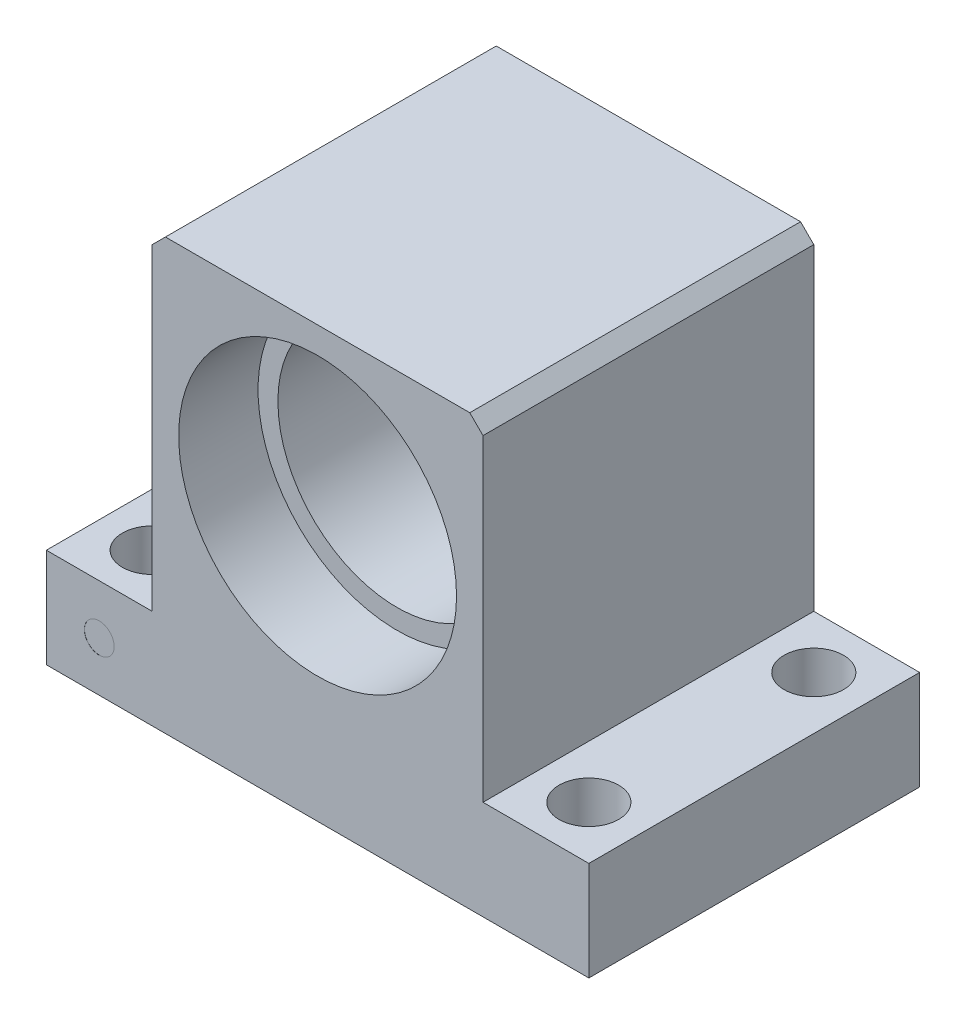
ISO-10303-21;
HEADER;
FILE_DESCRIPTION(('STEP AP214'),'2;1');
FILE_NAME('part.step','',(''),(''),'','','');
FILE_SCHEMA(('AUTOMOTIVE_DESIGN { 1 0 10303 214 1 1 1 1 }'));
ENDSEC;
DATA;
#1=APPLICATION_CONTEXT('core data for automotive mechanical design processes');
#2=APPLICATION_PROTOCOL_DEFINITION('international standard','automotive_design',2000,#1);
#3=PRODUCT_CONTEXT('',#1,'mechanical');
#4=PRODUCT('Part','Part','',(#3));
#5=PRODUCT_RELATED_PRODUCT_CATEGORY('part','',(#4));
#6=PRODUCT_DEFINITION_FORMATION('','',#4);
#7=PRODUCT_DEFINITION_CONTEXT('part definition',#1,'design');
#8=PRODUCT_DEFINITION('design','',#6,#7);
#9=PRODUCT_DEFINITION_SHAPE('','',#8);
#10=(LENGTH_UNIT() NAMED_UNIT(*) SI_UNIT(.MILLI.,.METRE.));
#11=(NAMED_UNIT(*) PLANE_ANGLE_UNIT() SI_UNIT($,.RADIAN.));
#12=(NAMED_UNIT(*) SI_UNIT($,.STERADIAN.) SOLID_ANGLE_UNIT());
#13=UNCERTAINTY_MEASURE_WITH_UNIT(LENGTH_MEASURE(1.E-05),#10,'distance_accuracy_value','');
#14=(GEOMETRIC_REPRESENTATION_CONTEXT(3) GLOBAL_UNCERTAINTY_ASSIGNED_CONTEXT((#13)) GLOBAL_UNIT_ASSIGNED_CONTEXT((#10,
#11,#12)) REPRESENTATION_CONTEXT('',''));
#15=CARTESIAN_POINT('',(0.,0.,0.));
#16=DIRECTION('',(0.,0.,1.));
#17=DIRECTION('',(1.,0.,0.));
#18=AXIS2_PLACEMENT_3D('',#15,#16,#17);
#19=CARTESIAN_POINT('',(0.,0.,-25.));
#20=DIRECTION('',(0.,0.,1.));
#21=DIRECTION('',(1.,0.,0.));
#22=AXIS2_PLACEMENT_3D('',#19,#20,#21);
#23=CYLINDRICAL_SURFACE('',#22,18.);
#24=CARTESIAN_POINT('',(0.,0.,13.));
#25=DIRECTION('',(0.,0.,1.));
#26=DIRECTION('',(1.,0.,0.));
#27=AXIS2_PLACEMENT_3D('',#24,#25,#26);
#28=CIRCLE('',#27,18.);
#29=CARTESIAN_POINT('',(18.,0.,13.));
#30=VERTEX_POINT('',#29);
#31=EDGE_CURVE('E20',#30,#30,#28,.F.);
#32=ORIENTED_EDGE('',*,*,#31,.F.);
#33=EDGE_LOOP('',(#32));
#34=FACE_BOUND('',#33,.T.);
#35=CARTESIAN_POINT('',(0.,0.,-13.));
#36=DIRECTION('',(0.,0.,1.));
#37=DIRECTION('',(1.,0.,0.));
#38=AXIS2_PLACEMENT_3D('',#35,#36,#37);
#39=CIRCLE('',#38,18.);
#40=CARTESIAN_POINT('',(18.,0.,-13.));
#41=VERTEX_POINT('',#40);
#42=EDGE_CURVE('E178',#41,#41,#39,.T.);
#43=ORIENTED_EDGE('',*,*,#42,.F.);
#44=EDGE_LOOP('',(#43));
#45=FACE_BOUND('',#44,.T.);
#46=ADVANCED_FACE('F17',(#34,#45),#23,.F.);
#47=CARTESIAN_POINT('',(-33.,-32.5,24.98));
#48=DIRECTION('',(0.,0.,1.));
#49=DIRECTION('',(1.,0.,0.));
#50=AXIS2_PLACEMENT_3D('',#47,#48,#49);
#51=PLANE('',#50);
#52=CARTESIAN_POINT('',(-33.,-32.5,24.98));
#53=DIRECTION('',(0.,0.,-1.));
#54=DIRECTION('',(-1.,0.,0.));
#55=AXIS2_PLACEMENT_3D('',#52,#53,#54);
#56=CIRCLE('',#55,2.25);
#57=CARTESIAN_POINT('',(-35.25,-32.5,24.98));
#58=VERTEX_POINT('',#57);
#59=EDGE_CURVE('E176',#58,#58,#56,.F.);
#60=ORIENTED_EDGE('',*,*,#59,.T.);
#61=EDGE_LOOP('',(#60));
#62=FACE_BOUND('',#61,.T.);
#63=ADVANCED_FACE('F190',(#62),#51,.T.);
#64=CARTESIAN_POINT('',(0.,21.,13.));
#65=DIRECTION('',(0.,0.,1.));
#66=DIRECTION('',(1.,0.,0.));
#67=AXIS2_PLACEMENT_3D('',#64,#65,#66);
#68=PLANE('',#67);
#69=ORIENTED_EDGE('',*,*,#31,.T.);
#70=EDGE_LOOP('',(#69));
#71=FACE_BOUND('',#70,.T.);
#72=CARTESIAN_POINT('',(0.,0.,13.));
#73=DIRECTION('',(0.,0.,1.));
#74=DIRECTION('',(1.,0.,0.));
#75=AXIS2_PLACEMENT_3D('',#72,#73,#74);
#76=CIRCLE('',#75,21.);
#77=CARTESIAN_POINT('',(21.,0.,13.));
#78=VERTEX_POINT('',#77);
#79=EDGE_CURVE('E137',#78,#78,#76,.T.);
#80=ORIENTED_EDGE('',*,*,#79,.T.);
#81=EDGE_LOOP('',(#80));
#82=FACE_BOUND('',#81,.T.);
#83=ADVANCED_FACE('F185',(#71,#82),#68,.T.);
#84=CARTESIAN_POINT('',(0.,18.,-13.));
#85=DIRECTION('',(0.,0.,-1.));
#86=DIRECTION('',(-1.,0.,0.));
#87=AXIS2_PLACEMENT_3D('',#84,#85,#86);
#88=PLANE('',#87);
#89=ORIENTED_EDGE('',*,*,#42,.T.);
#90=EDGE_LOOP('',(#89));
#91=FACE_BOUND('',#90,.T.);
#92=CARTESIAN_POINT('',(0.,0.,-13.));
#93=DIRECTION('',(0.,0.,1.));
#94=DIRECTION('',(1.,0.,0.));
#95=AXIS2_PLACEMENT_3D('',#92,#93,#94);
#96=CIRCLE('',#95,21.);
#97=CARTESIAN_POINT('',(21.,0.,-13.));
#98=VERTEX_POINT('',#97);
#99=EDGE_CURVE('E116',#98,#98,#96,.F.);
#100=ORIENTED_EDGE('',*,*,#99,.T.);
#101=EDGE_LOOP('',(#100));
#102=FACE_BOUND('',#101,.T.);
#103=ADVANCED_FACE('F270',(#91,#102),#88,.T.);
#104=CARTESIAN_POINT('',(-33.,-32.5,24.98));
#105=DIRECTION('',(0.,0.,-1.));
#106=DIRECTION('',(-1.,0.,0.));
#107=AXIS2_PLACEMENT_3D('',#104,#105,#106);
#108=CYLINDRICAL_SURFACE('',#107,2.25);
#109=ORIENTED_EDGE('',*,*,#59,.F.);
#110=EDGE_LOOP('',(#109));
#111=FACE_BOUND('',#110,.T.);
#112=CARTESIAN_POINT('',(-33.,-32.5,25.));
#113=DIRECTION('',(0.,0.,-1.));
#114=DIRECTION('',(-1.,0.,0.));
#115=AXIS2_PLACEMENT_3D('',#112,#113,#114);
#116=CIRCLE('',#115,2.25);
#117=CARTESIAN_POINT('',(-35.25,-32.5,25.));
#118=VERTEX_POINT('',#117);
#119=EDGE_CURVE('E169',#118,#118,#116,.T.);
#120=ORIENTED_EDGE('',*,*,#119,.F.);
#121=EDGE_LOOP('',(#120));
#122=FACE_BOUND('',#121,.T.);
#123=ADVANCED_FACE('F266',(#111,#122),#108,.F.);
#124=CARTESIAN_POINT('',(0.,0.,-25.));
#125=DIRECTION('',(0.,0.,1.));
#126=DIRECTION('',(1.,0.,0.));
#127=AXIS2_PLACEMENT_3D('',#124,#125,#126);
#128=CYLINDRICAL_SURFACE('',#127,21.);
#129=CARTESIAN_POINT('',(0.,0.,25.));
#130=DIRECTION('',(0.,0.,1.));
#131=DIRECTION('',(1.,0.,0.));
#132=AXIS2_PLACEMENT_3D('',#129,#130,#131);
#133=CIRCLE('',#132,21.);
#134=CARTESIAN_POINT('',(21.,0.,25.));
#135=VERTEX_POINT('',#134);
#136=EDGE_CURVE('E165',#135,#135,#133,.F.);
#137=ORIENTED_EDGE('',*,*,#136,.F.);
#138=EDGE_LOOP('',(#137));
#139=FACE_BOUND('',#138,.T.);
#140=ORIENTED_EDGE('',*,*,#79,.F.);
#141=EDGE_LOOP('',(#140));
#142=FACE_BOUND('',#141,.T.);
#143=ADVANCED_FACE('F262',(#139,#142),#128,.F.);
#144=CARTESIAN_POINT('',(-25.,25.,25.));
#145=DIRECTION('',(1.,0.,0.));
#146=DIRECTION('',(0.,0.,-1.));
#147=AXIS2_PLACEMENT_3D('',#144,#145,#146);
#148=PLANE('',#147);
#149=DIRECTION('',(0.,0.,-1.));
#150=VECTOR('',#149,1.);
#151=CARTESIAN_POINT('',(-25.,-25.,25.));
#152=LINE('',#151,#150);
#153=CARTESIAN_POINT('',(-25.,-25.,-25.));
#154=VERTEX_POINT('',#153);
#155=CARTESIAN_POINT('',(-25.,-25.,25.));
#156=VERTEX_POINT('',#155);
#157=EDGE_CURVE('E131',#154,#156,#152,.F.);
#158=ORIENTED_EDGE('',*,*,#157,.T.);
#159=DIRECTION('',(0.,1.,0.));
#160=VECTOR('',#159,1.);
#161=CARTESIAN_POINT('',(-25.,0.,25.));
#162=LINE('',#161,#160);
#163=CARTESIAN_POINT('',(-25.,23.,25.));
#164=VERTEX_POINT('',#163);
#165=EDGE_CURVE('E121',#164,#156,#162,.F.);
#166=ORIENTED_EDGE('',*,*,#165,.F.);
#167=DIRECTION('',(0.,0.,1.));
#168=VECTOR('',#167,1.);
#169=CARTESIAN_POINT('',(-25.,23.,25.));
#170=LINE('',#169,#168);
#171=CARTESIAN_POINT('',(-25.,23.,-25.));
#172=VERTEX_POINT('',#171);
#173=EDGE_CURVE('E117',#172,#164,#170,.T.);
#174=ORIENTED_EDGE('',*,*,#173,.F.);
#175=DIRECTION('',(0.,1.,0.));
#176=VECTOR('',#175,1.);
#177=CARTESIAN_POINT('',(-25.,0.,-25.));
#178=LINE('',#177,#176);
#179=EDGE_CURVE('E428',#172,#154,#178,.F.);
#180=ORIENTED_EDGE('',*,*,#179,.T.);
#181=EDGE_LOOP('',(#158,#166,#174,#180));
#182=FACE_BOUND('',#181,.T.);
#183=ADVANCED_FACE('F258',(#182),#148,.F.);
#184=CARTESIAN_POINT('',(25.,-25.,25.));
#185=DIRECTION('',(-1.,0.,0.));
#186=DIRECTION('',(0.,0.,1.));
#187=AXIS2_PLACEMENT_3D('',#184,#185,#186);
#188=PLANE('',#187);
#189=DIRECTION('',(0.,0.,1.));
#190=VECTOR('',#189,1.);
#191=CARTESIAN_POINT('',(25.,23.,25.));
#192=LINE('',#191,#190);
#193=CARTESIAN_POINT('',(25.,23.,25.));
#194=VERTEX_POINT('',#193);
#195=CARTESIAN_POINT('',(25.,23.,-25.));
#196=VERTEX_POINT('',#195);
#197=EDGE_CURVE('E136',#194,#196,#192,.F.);
#198=ORIENTED_EDGE('',*,*,#197,.F.);
#199=DIRECTION('',(0.,1.,0.));
#200=VECTOR('',#199,1.);
#201=CARTESIAN_POINT('',(25.,0.,25.));
#202=LINE('',#201,#200);
#203=CARTESIAN_POINT('',(25.,-25.,25.));
#204=VERTEX_POINT('',#203);
#205=EDGE_CURVE('E439',#204,#194,#202,.T.);
#206=ORIENTED_EDGE('',*,*,#205,.F.);
#207=DIRECTION('',(0.,0.,-1.));
#208=VECTOR('',#207,1.);
#209=CARTESIAN_POINT('',(25.,-25.,25.));
#210=LINE('',#209,#208);
#211=CARTESIAN_POINT('',(25.,-25.,-25.));
#212=VERTEX_POINT('',#211);
#213=EDGE_CURVE('E129',#204,#212,#210,.T.);
#214=ORIENTED_EDGE('',*,*,#213,.T.);
#215=DIRECTION('',(0.,1.,0.));
#216=VECTOR('',#215,1.);
#217=CARTESIAN_POINT('',(25.,0.,-25.));
#218=LINE('',#217,#216);
#219=EDGE_CURVE('E456',#212,#196,#218,.T.);
#220=ORIENTED_EDGE('',*,*,#219,.T.);
#221=EDGE_LOOP('',(#198,#206,#214,#220));
#222=FACE_BOUND('',#221,.T.);
#223=ADVANCED_FACE('F255',(#222),#188,.F.);
#224=CARTESIAN_POINT('',(23.,25.,25.));
#225=DIRECTION('',(0.707106781186548,0.707106781186548,0.));
#226=DIRECTION('',(-0.707106781186548,0.707106781186548,0.));
#227=AXIS2_PLACEMENT_3D('',#224,#225,#226);
#228=PLANE('',#227);
#229=DIRECTION('',(-0.707106781186547,0.707106781186547,0.));
#230=VECTOR('',#229,1.);
#231=CARTESIAN_POINT('',(25.,23.,25.));
#232=LINE('',#231,#230);
#233=CARTESIAN_POINT('',(23.,25.,25.));
#234=VERTEX_POINT('',#233);
#235=EDGE_CURVE('E104',#194,#234,#232,.T.);
#236=ORIENTED_EDGE('',*,*,#235,.F.);
#237=ORIENTED_EDGE('',*,*,#197,.T.);
#238=DIRECTION('',(-0.707106781186547,0.707106781186547,0.));
#239=VECTOR('',#238,1.);
#240=CARTESIAN_POINT('',(25.,23.,-25.));
#241=LINE('',#240,#239);
#242=CARTESIAN_POINT('',(23.,25.,-25.));
#243=VERTEX_POINT('',#242);
#244=EDGE_CURVE('E459',#196,#243,#241,.T.);
#245=ORIENTED_EDGE('',*,*,#244,.T.);
#246=DIRECTION('',(0.,0.,-1.));
#247=VECTOR('',#246,1.);
#248=CARTESIAN_POINT('',(23.,25.,25.));
#249=LINE('',#248,#247);
#250=EDGE_CURVE('E92',#243,#234,#249,.F.);
#251=ORIENTED_EDGE('',*,*,#250,.T.);
#252=EDGE_LOOP('',(#236,#237,#245,#251));
#253=FACE_BOUND('',#252,.T.);
#254=ADVANCED_FACE('F252',(#253),#228,.T.);
#255=CARTESIAN_POINT('',(25.,25.,25.));
#256=DIRECTION('',(0.,-1.,0.));
#257=DIRECTION('',(0.,0.,-1.));
#258=AXIS2_PLACEMENT_3D('',#255,#256,#257);
#259=PLANE('',#258);
#260=DIRECTION('',(1.,0.,0.));
#261=VECTOR('',#260,1.);
#262=CARTESIAN_POINT('',(0.,25.,25.));
#263=LINE('',#262,#261);
#264=CARTESIAN_POINT('',(-23.,25.,25.));
#265=VERTEX_POINT('',#264);
#266=EDGE_CURVE('E98',#234,#265,#263,.F.);
#267=ORIENTED_EDGE('',*,*,#266,.F.);
#268=ORIENTED_EDGE('',*,*,#250,.F.);
#269=DIRECTION('',(1.,0.,0.));
#270=VECTOR('',#269,1.);
#271=CARTESIAN_POINT('',(0.,25.,-25.));
#272=LINE('',#271,#270);
#273=CARTESIAN_POINT('',(-23.,25.,-25.));
#274=VERTEX_POINT('',#273);
#275=EDGE_CURVE('E112',#243,#274,#272,.F.);
#276=ORIENTED_EDGE('',*,*,#275,.T.);
#277=DIRECTION('',(0.,0.,1.));
#278=VECTOR('',#277,1.);
#279=CARTESIAN_POINT('',(-23.,25.,25.));
#280=LINE('',#279,#278);
#281=EDGE_CURVE('E109',#265,#274,#280,.F.);
#282=ORIENTED_EDGE('',*,*,#281,.F.);
#283=EDGE_LOOP('',(#267,#268,#276,#282));
#284=FACE_BOUND('',#283,.T.);
#285=ADVANCED_FACE('F110',(#284),#259,.F.);
#286=CARTESIAN_POINT('',(-25.,23.,25.));
#287=DIRECTION('',(-0.707106781186548,0.707106781186548,0.));
#288=DIRECTION('',(-0.707106781186548,-0.707106781186548,0.));
#289=AXIS2_PLACEMENT_3D('',#286,#287,#288);
#290=PLANE('',#289);
#291=DIRECTION('',(-0.707106781186547,-0.707106781186547,0.));
#292=VECTOR('',#291,1.);
#293=CARTESIAN_POINT('',(-23.,25.,25.));
#294=LINE('',#293,#292);
#295=EDGE_CURVE('E102',#265,#164,#294,.T.);
#296=ORIENTED_EDGE('',*,*,#295,.F.);
#297=ORIENTED_EDGE('',*,*,#281,.T.);
#298=DIRECTION('',(-0.707106781186547,-0.707106781186547,0.));
#299=VECTOR('',#298,1.);
#300=CARTESIAN_POINT('',(-23.,25.,-25.));
#301=LINE('',#300,#299);
#302=EDGE_CURVE('E164',#274,#172,#301,.T.);
#303=ORIENTED_EDGE('',*,*,#302,.T.);
#304=ORIENTED_EDGE('',*,*,#173,.T.);
#305=EDGE_LOOP('',(#296,#297,#303,#304));
#306=FACE_BOUND('',#305,.T.);
#307=ADVANCED_FACE('F119',(#306),#290,.T.);
#308=CARTESIAN_POINT('',(0.,0.,-25.));
#309=DIRECTION('',(0.,0.,1.));
#310=DIRECTION('',(1.,0.,0.));
#311=AXIS2_PLACEMENT_3D('',#308,#309,#310);
#312=CYLINDRICAL_SURFACE('',#311,21.);
#313=CARTESIAN_POINT('',(0.,0.,-25.));
#314=DIRECTION('',(0.,0.,1.));
#315=DIRECTION('',(1.,0.,0.));
#316=AXIS2_PLACEMENT_3D('',#313,#314,#315);
#317=CIRCLE('',#316,21.);
#318=CARTESIAN_POINT('',(21.,0.,-25.));
#319=VERTEX_POINT('',#318);
#320=EDGE_CURVE('E161',#319,#319,#317,.F.);
#321=ORIENTED_EDGE('',*,*,#320,.T.);
#322=EDGE_LOOP('',(#321));
#323=FACE_BOUND('',#322,.T.);
#324=ORIENTED_EDGE('',*,*,#99,.F.);
#325=EDGE_LOOP('',(#324));
#326=FACE_BOUND('',#325,.T.);
#327=ADVANCED_FACE('F243',(#323,#326),#312,.F.);
#328=CARTESIAN_POINT('',(-25.,-25.,25.));
#329=DIRECTION('',(0.,-1.,0.));
#330=DIRECTION('',(0.,0.,-1.));
#331=AXIS2_PLACEMENT_3D('',#328,#329,#330);
#332=PLANE('',#331);
#333=CARTESIAN_POINT('',(-33.,-25.,17.));
#334=DIRECTION('',(0.,1.,0.));
#335=DIRECTION('',(0.,0.,1.));
#336=AXIS2_PLACEMENT_3D('',#333,#334,#335);
#337=CIRCLE('',#336,4.5);
#338=CARTESIAN_POINT('',(-33.,-25.,21.5));
#339=VERTEX_POINT('',#338);
#340=EDGE_CURVE('E152',#339,#339,#337,.F.);
#341=ORIENTED_EDGE('',*,*,#340,.T.);
#342=EDGE_LOOP('',(#341));
#343=FACE_BOUND('',#342,.T.);
#344=CARTESIAN_POINT('',(-33.,-25.,-17.));
#345=DIRECTION('',(0.,1.,0.));
#346=DIRECTION('',(0.,0.,1.));
#347=AXIS2_PLACEMENT_3D('',#344,#345,#346);
#348=CIRCLE('',#347,4.5);
#349=CARTESIAN_POINT('',(-33.,-25.,-12.5));
#350=VERTEX_POINT('',#349);
#351=EDGE_CURVE('E155',#350,#350,#348,.F.);
#352=ORIENTED_EDGE('',*,*,#351,.T.);
#353=EDGE_LOOP('',(#352));
#354=FACE_BOUND('',#353,.T.);
#355=DIRECTION('',(0.,0.,-1.));
#356=VECTOR('',#355,1.);
#357=CARTESIAN_POINT('',(-41.,-25.,25.));
#358=LINE('',#357,#356);
#359=CARTESIAN_POINT('',(-41.,-25.,-25.));
#360=VERTEX_POINT('',#359);
#361=CARTESIAN_POINT('',(-41.,-25.,25.));
#362=VERTEX_POINT('',#361);
#363=EDGE_CURVE('E106',#360,#362,#358,.F.);
#364=ORIENTED_EDGE('',*,*,#363,.T.);
#365=DIRECTION('',(1.,0.,0.));
#366=VECTOR('',#365,1.);
#367=CARTESIAN_POINT('',(0.,-25.,25.));
#368=LINE('',#367,#366);
#369=EDGE_CURVE('E123',#156,#362,#368,.F.);
#370=ORIENTED_EDGE('',*,*,#369,.F.);
#371=ORIENTED_EDGE('',*,*,#157,.F.);
#372=DIRECTION('',(1.,0.,0.));
#373=VECTOR('',#372,1.);
#374=CARTESIAN_POINT('',(0.,-25.,-25.));
#375=LINE('',#374,#373);
#376=EDGE_CURVE('E447',#154,#360,#375,.F.);
#377=ORIENTED_EDGE('',*,*,#376,.T.);
#378=EDGE_LOOP('',(#364,#370,#371,#377));
#379=FACE_BOUND('',#378,.T.);
#380=ADVANCED_FACE('F239',(#343,#354,#379),#332,.F.);
#381=CARTESIAN_POINT('',(41.,-25.,25.));
#382=DIRECTION('',(0.,-1.,0.));
#383=DIRECTION('',(0.,0.,-1.));
#384=AXIS2_PLACEMENT_3D('',#381,#382,#383);
#385=PLANE('',#384);
#386=CARTESIAN_POINT('',(33.,-25.,17.));
#387=DIRECTION('',(0.,1.,0.));
#388=DIRECTION('',(0.,0.,1.));
#389=AXIS2_PLACEMENT_3D('',#386,#387,#388);
#390=CIRCLE('',#389,4.5);
#391=CARTESIAN_POINT('',(33.,-25.,21.5));
#392=VERTEX_POINT('',#391);
#393=EDGE_CURVE('E148',#392,#392,#390,.F.);
#394=ORIENTED_EDGE('',*,*,#393,.T.);
#395=EDGE_LOOP('',(#394));
#396=FACE_BOUND('',#395,.T.);
#397=CARTESIAN_POINT('',(33.,-25.,-17.));
#398=DIRECTION('',(0.,1.,0.));
#399=DIRECTION('',(0.,0.,1.));
#400=AXIS2_PLACEMENT_3D('',#397,#398,#399);
#401=CIRCLE('',#400,4.5);
#402=CARTESIAN_POINT('',(33.,-25.,-12.5));
#403=VERTEX_POINT('',#402);
#404=EDGE_CURVE('E158',#403,#403,#401,.F.);
#405=ORIENTED_EDGE('',*,*,#404,.T.);
#406=EDGE_LOOP('',(#405));
#407=FACE_BOUND('',#406,.T.);
#408=ORIENTED_EDGE('',*,*,#213,.F.);
#409=DIRECTION('',(1.,0.,0.));
#410=VECTOR('',#409,1.);
#411=CARTESIAN_POINT('',(0.,-25.,25.));
#412=LINE('',#411,#410);
#413=CARTESIAN_POINT('',(41.,-25.,25.));
#414=VERTEX_POINT('',#413);
#415=EDGE_CURVE('E434',#414,#204,#412,.F.);
#416=ORIENTED_EDGE('',*,*,#415,.F.);
#417=DIRECTION('',(0.,0.,1.));
#418=VECTOR('',#417,1.);
#419=CARTESIAN_POINT('',(41.,-25.,25.));
#420=LINE('',#419,#418);
#421=CARTESIAN_POINT('',(41.,-25.,-25.));
#422=VERTEX_POINT('',#421);
#423=EDGE_CURVE('E444',#414,#422,#420,.F.);
#424=ORIENTED_EDGE('',*,*,#423,.T.);
#425=DIRECTION('',(1.,0.,0.));
#426=VECTOR('',#425,1.);
#427=CARTESIAN_POINT('',(0.,-25.,-25.));
#428=LINE('',#427,#426);
#429=EDGE_CURVE('E453',#422,#212,#428,.F.);
#430=ORIENTED_EDGE('',*,*,#429,.T.);
#431=EDGE_LOOP('',(#408,#416,#424,#430));
#432=FACE_BOUND('',#431,.T.);
#433=ADVANCED_FACE('F235',(#396,#407,#432),#385,.F.);
#434=CARTESIAN_POINT('',(-41.,-25.,25.));
#435=DIRECTION('',(1.,0.,0.));
#436=DIRECTION('',(0.,0.,-1.));
#437=AXIS2_PLACEMENT_3D('',#434,#435,#436);
#438=PLANE('',#437);
#439=DIRECTION('',(0.,0.,1.));
#440=VECTOR('',#439,1.);
#441=CARTESIAN_POINT('',(-41.,-40.,25.));
#442=LINE('',#441,#440);
#443=CARTESIAN_POINT('',(-41.,-40.,-25.));
#444=VERTEX_POINT('',#443);
#445=CARTESIAN_POINT('',(-41.,-40.,25.));
#446=VERTEX_POINT('',#445);
#447=EDGE_CURVE('E151',#444,#446,#442,.T.);
#448=ORIENTED_EDGE('',*,*,#447,.T.);
#449=DIRECTION('',(0.,1.,0.));
#450=VECTOR('',#449,1.);
#451=CARTESIAN_POINT('',(-41.,0.,25.));
#452=LINE('',#451,#450);
#453=EDGE_CURVE('E433',#362,#446,#452,.F.);
#454=ORIENTED_EDGE('',*,*,#453,.F.);
#455=ORIENTED_EDGE('',*,*,#363,.F.);
#456=DIRECTION('',(0.,1.,0.));
#457=VECTOR('',#456,1.);
#458=CARTESIAN_POINT('',(-41.,0.,-25.));
#459=LINE('',#458,#457);
#460=EDGE_CURVE('E449',#360,#444,#459,.F.);
#461=ORIENTED_EDGE('',*,*,#460,.T.);
#462=EDGE_LOOP('',(#448,#454,#455,#461));
#463=FACE_BOUND('',#462,.T.);
#464=ADVANCED_FACE('F231',(#463),#438,.F.);
#465=CARTESIAN_POINT('',(0.,0.,25.));
#466=DIRECTION('',(0.,0.,1.));
#467=DIRECTION('',(1.,0.,0.));
#468=AXIS2_PLACEMENT_3D('',#465,#466,#467);
#469=PLANE('',#468);
#470=ORIENTED_EDGE('',*,*,#136,.T.);
#471=EDGE_LOOP('',(#470));
#472=FACE_BOUND('',#471,.T.);
#473=ORIENTED_EDGE('',*,*,#119,.T.);
#474=EDGE_LOOP('',(#473));
#475=FACE_BOUND('',#474,.T.);
#476=ORIENTED_EDGE('',*,*,#205,.T.);
#477=ORIENTED_EDGE('',*,*,#235,.T.);
#478=ORIENTED_EDGE('',*,*,#266,.T.);
#479=ORIENTED_EDGE('',*,*,#295,.T.);
#480=ORIENTED_EDGE('',*,*,#165,.T.);
#481=ORIENTED_EDGE('',*,*,#369,.T.);
#482=ORIENTED_EDGE('',*,*,#453,.T.);
#483=DIRECTION('',(1.,0.,0.));
#484=VECTOR('',#483,1.);
#485=CARTESIAN_POINT('',(-41.,-40.,25.));
#486=LINE('',#485,#484);
#487=CARTESIAN_POINT('',(41.,-40.,25.));
#488=VERTEX_POINT('',#487);
#489=EDGE_CURVE('E465',#446,#488,#486,.T.);
#490=ORIENTED_EDGE('',*,*,#489,.T.);
#491=DIRECTION('',(0.,1.,0.));
#492=VECTOR('',#491,1.);
#493=CARTESIAN_POINT('',(41.,-40.,25.));
#494=LINE('',#493,#492);
#495=EDGE_CURVE('E168',#488,#414,#494,.T.);
#496=ORIENTED_EDGE('',*,*,#495,.T.);
#497=ORIENTED_EDGE('',*,*,#415,.T.);
#498=EDGE_LOOP('',(#476,#477,#478,#479,#480,#481,#482,#490,#496,#497));
#499=FACE_BOUND('',#498,.T.);
#500=ADVANCED_FACE('F100',(#472,#475,#499),#469,.T.);
#501=CARTESIAN_POINT('',(41.,-40.,25.));
#502=DIRECTION('',(-1.,0.,0.));
#503=DIRECTION('',(0.,0.,1.));
#504=AXIS2_PLACEMENT_3D('',#501,#502,#503);
#505=PLANE('',#504);
#506=ORIENTED_EDGE('',*,*,#423,.F.);
#507=ORIENTED_EDGE('',*,*,#495,.F.);
#508=DIRECTION('',(0.,0.,1.));
#509=VECTOR('',#508,1.);
#510=CARTESIAN_POINT('',(41.,-40.,25.));
#511=LINE('',#510,#509);
#512=CARTESIAN_POINT('',(41.,-40.,-25.));
#513=VERTEX_POINT('',#512);
#514=EDGE_CURVE('E468',#488,#513,#511,.F.);
#515=ORIENTED_EDGE('',*,*,#514,.T.);
#516=DIRECTION('',(0.,1.,0.));
#517=VECTOR('',#516,1.);
#518=CARTESIAN_POINT('',(41.,0.,-25.));
#519=LINE('',#518,#517);
#520=EDGE_CURVE('E35',#513,#422,#519,.T.);
#521=ORIENTED_EDGE('',*,*,#520,.T.);
#522=EDGE_LOOP('',(#506,#507,#515,#521));
#523=FACE_BOUND('',#522,.T.);
#524=ADVANCED_FACE('F224',(#523),#505,.F.);
#525=CARTESIAN_POINT('',(0.,0.,-25.));
#526=DIRECTION('',(0.,0.,1.));
#527=DIRECTION('',(1.,0.,0.));
#528=AXIS2_PLACEMENT_3D('',#525,#526,#527);
#529=PLANE('',#528);
#530=ORIENTED_EDGE('',*,*,#320,.F.);
#531=EDGE_LOOP('',(#530));
#532=FACE_BOUND('',#531,.T.);
#533=ORIENTED_EDGE('',*,*,#275,.F.);
#534=ORIENTED_EDGE('',*,*,#244,.F.);
#535=ORIENTED_EDGE('',*,*,#219,.F.);
#536=ORIENTED_EDGE('',*,*,#429,.F.);
#537=ORIENTED_EDGE('',*,*,#520,.F.);
#538=DIRECTION('',(1.,0.,0.));
#539=VECTOR('',#538,1.);
#540=CARTESIAN_POINT('',(-41.,-40.,-25.));
#541=LINE('',#540,#539);
#542=EDGE_CURVE('E147',#513,#444,#541,.F.);
#543=ORIENTED_EDGE('',*,*,#542,.T.);
#544=ORIENTED_EDGE('',*,*,#460,.F.);
#545=ORIENTED_EDGE('',*,*,#376,.F.);
#546=ORIENTED_EDGE('',*,*,#179,.F.);
#547=ORIENTED_EDGE('',*,*,#302,.F.);
#548=EDGE_LOOP('',(#533,#534,#535,#536,#537,#543,#544,#545,#546,#547));
#549=FACE_BOUND('',#548,.T.);
#550=ADVANCED_FACE('F220',(#532,#549),#529,.F.);
#551=CARTESIAN_POINT('',(33.,-25.,-17.));
#552=DIRECTION('',(0.,1.,0.));
#553=DIRECTION('',(0.,0.,1.));
#554=AXIS2_PLACEMENT_3D('',#551,#552,#553);
#555=CYLINDRICAL_SURFACE('',#554,4.5);
#556=ORIENTED_EDGE('',*,*,#404,.F.);
#557=EDGE_LOOP('',(#556));
#558=FACE_BOUND('',#557,.T.);
#559=CARTESIAN_POINT('',(33.,-40.,-17.));
#560=DIRECTION('',(0.,1.,0.));
#561=DIRECTION('',(0.,0.,1.));
#562=AXIS2_PLACEMENT_3D('',#559,#560,#561);
#563=CIRCLE('',#562,4.5);
#564=CARTESIAN_POINT('',(33.,-40.,-12.5));
#565=VERTEX_POINT('',#564);
#566=EDGE_CURVE('E144',#565,#565,#563,.F.);
#567=ORIENTED_EDGE('',*,*,#566,.T.);
#568=EDGE_LOOP('',(#567));
#569=FACE_BOUND('',#568,.T.);
#570=ADVANCED_FACE('F216',(#558,#569),#555,.F.);
#571=CARTESIAN_POINT('',(-33.,-25.,-17.));
#572=DIRECTION('',(0.,1.,0.));
#573=DIRECTION('',(0.,0.,1.));
#574=AXIS2_PLACEMENT_3D('',#571,#572,#573);
#575=CYLINDRICAL_SURFACE('',#574,4.5);
#576=ORIENTED_EDGE('',*,*,#351,.F.);
#577=EDGE_LOOP('',(#576));
#578=FACE_BOUND('',#577,.T.);
#579=CARTESIAN_POINT('',(-33.,-40.,-17.));
#580=DIRECTION('',(0.,1.,0.));
#581=DIRECTION('',(0.,0.,1.));
#582=AXIS2_PLACEMENT_3D('',#579,#580,#581);
#583=CIRCLE('',#582,4.5);
#584=CARTESIAN_POINT('',(-33.,-40.,-12.5));
#585=VERTEX_POINT('',#584);
#586=EDGE_CURVE('E141',#585,#585,#583,.F.);
#587=ORIENTED_EDGE('',*,*,#586,.T.);
#588=EDGE_LOOP('',(#587));
#589=FACE_BOUND('',#588,.T.);
#590=ADVANCED_FACE('F212',(#578,#589),#575,.F.);
#591=CARTESIAN_POINT('',(-33.,-25.,17.));
#592=DIRECTION('',(0.,1.,0.));
#593=DIRECTION('',(0.,0.,1.));
#594=AXIS2_PLACEMENT_3D('',#591,#592,#593);
#595=CYLINDRICAL_SURFACE('',#594,4.5);
#596=ORIENTED_EDGE('',*,*,#340,.F.);
#597=EDGE_LOOP('',(#596));
#598=FACE_BOUND('',#597,.T.);
#599=CARTESIAN_POINT('',(-33.,-40.,17.));
#600=DIRECTION('',(0.,1.,0.));
#601=DIRECTION('',(0.,0.,1.));
#602=AXIS2_PLACEMENT_3D('',#599,#600,#601);
#603=CIRCLE('',#602,4.5);
#604=CARTESIAN_POINT('',(-33.,-40.,21.5));
#605=VERTEX_POINT('',#604);
#606=EDGE_CURVE('E26',#605,#605,#603,.F.);
#607=ORIENTED_EDGE('',*,*,#606,.T.);
#608=EDGE_LOOP('',(#607));
#609=FACE_BOUND('',#608,.T.);
#610=ADVANCED_FACE('F204',(#598,#609),#595,.F.);
#611=CARTESIAN_POINT('',(33.,-25.,17.));
#612=DIRECTION('',(0.,1.,0.));
#613=DIRECTION('',(0.,0.,1.));
#614=AXIS2_PLACEMENT_3D('',#611,#612,#613);
#615=CYLINDRICAL_SURFACE('',#614,4.5);
#616=CARTESIAN_POINT('',(33.,-40.,17.));
#617=DIRECTION('',(0.,1.,0.));
#618=DIRECTION('',(0.,0.,1.));
#619=AXIS2_PLACEMENT_3D('',#616,#617,#618);
#620=CIRCLE('',#619,4.5);
#621=CARTESIAN_POINT('',(33.,-40.,21.5));
#622=VERTEX_POINT('',#621);
#623=EDGE_CURVE('E11',#622,#622,#620,.F.);
#624=ORIENTED_EDGE('',*,*,#623,.T.);
#625=EDGE_LOOP('',(#624));
#626=FACE_BOUND('',#625,.T.);
#627=ORIENTED_EDGE('',*,*,#393,.F.);
#628=EDGE_LOOP('',(#627));
#629=FACE_BOUND('',#628,.T.);
#630=ADVANCED_FACE('F198',(#626,#629),#615,.F.);
#631=CARTESIAN_POINT('',(-41.,-40.,25.));
#632=DIRECTION('',(0.,1.,0.));
#633=DIRECTION('',(0.,0.,1.));
#634=AXIS2_PLACEMENT_3D('',#631,#632,#633);
#635=PLANE('',#634);
#636=ORIENTED_EDGE('',*,*,#623,.F.);
#637=EDGE_LOOP('',(#636));
#638=FACE_BOUND('',#637,.T.);
#639=ORIENTED_EDGE('',*,*,#606,.F.);
#640=EDGE_LOOP('',(#639));
#641=FACE_BOUND('',#640,.T.);
#642=ORIENTED_EDGE('',*,*,#586,.F.);
#643=EDGE_LOOP('',(#642));
#644=FACE_BOUND('',#643,.T.);
#645=ORIENTED_EDGE('',*,*,#566,.F.);
#646=EDGE_LOOP('',(#645));
#647=FACE_BOUND('',#646,.T.);
#648=ORIENTED_EDGE('',*,*,#514,.F.);
#649=ORIENTED_EDGE('',*,*,#489,.F.);
#650=ORIENTED_EDGE('',*,*,#447,.F.);
#651=ORIENTED_EDGE('',*,*,#542,.F.);
#652=EDGE_LOOP('',(#648,#649,#650,#651));
#653=FACE_BOUND('',#652,.T.);
#654=ADVANCED_FACE('F196',(#638,#641,#644,#647,#653),#635,.F.);
#655=CLOSED_SHELL('',(#46,#63,#83,#103,#123,#143,#183,#223,#254,#285,#307,#327,#380,#433,#464,
#500,#524,#550,#570,#590,#610,#630,#654));
#656=MANIFOLD_SOLID_BREP('B1',#655);
#657=ADVANCED_BREP_SHAPE_REPRESENTATION('',(#18,#656),#14);
#658=SHAPE_DEFINITION_REPRESENTATION(#9,#657);
ENDSEC;
END-ISO-10303-21;
